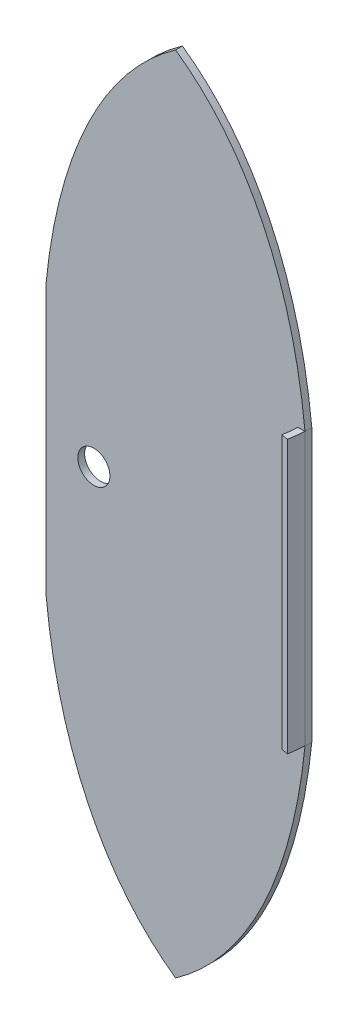
ISO-10303-21;
HEADER;
FILE_DESCRIPTION(('STEP AP214'),'2;1');
FILE_NAME('part.step','',(''),(''),'','','');
FILE_SCHEMA(('AUTOMOTIVE_DESIGN { 1 0 10303 214 1 1 1 1 }'));
ENDSEC;
DATA;
#1=APPLICATION_CONTEXT('core data for automotive mechanical design processes');
#2=APPLICATION_PROTOCOL_DEFINITION('international standard','automotive_design',2000,#1);
#3=PRODUCT_CONTEXT('',#1,'mechanical');
#4=PRODUCT('Part','Part','',(#3));
#5=PRODUCT_RELATED_PRODUCT_CATEGORY('part','',(#4));
#6=PRODUCT_DEFINITION_FORMATION('','',#4);
#7=PRODUCT_DEFINITION_CONTEXT('part definition',#1,'design');
#8=PRODUCT_DEFINITION('design','',#6,#7);
#9=PRODUCT_DEFINITION_SHAPE('','',#8);
#10=(LENGTH_UNIT() NAMED_UNIT(*) SI_UNIT(.MILLI.,.METRE.));
#11=(NAMED_UNIT(*) PLANE_ANGLE_UNIT() SI_UNIT($,.RADIAN.));
#12=(NAMED_UNIT(*) SI_UNIT($,.STERADIAN.) SOLID_ANGLE_UNIT());
#13=UNCERTAINTY_MEASURE_WITH_UNIT(LENGTH_MEASURE(1.E-05),#10,'distance_accuracy_value','');
#14=(GEOMETRIC_REPRESENTATION_CONTEXT(3) GLOBAL_UNCERTAINTY_ASSIGNED_CONTEXT((#13)) GLOBAL_UNIT_ASSIGNED_CONTEXT((#10,
#11,#12)) REPRESENTATION_CONTEXT('',''));
#15=CARTESIAN_POINT('',(0.,0.,0.));
#16=DIRECTION('',(0.,0.,1.));
#17=DIRECTION('',(1.,0.,0.));
#18=AXIS2_PLACEMENT_3D('',#15,#16,#17);
#19=CARTESIAN_POINT('',(0.,0.,2.54));
#20=DIRECTION('',(0.,0.,1.));
#21=DIRECTION('',(1.,0.,0.));
#22=AXIS2_PLACEMENT_3D('',#19,#20,#21);
#23=PLANE('',#22);
#24=CARTESIAN_POINT('',(48.26,-101.6,2.54));
#25=CARTESIAN_POINT('',(44.589659251185,-138.151390039636,2.54));
#26=CARTESIAN_POINT('',(31.4092908440623,-178.560823802817,2.54));
#27=CARTESIAN_POINT('',(0.,-200.66,2.54));
#28=B_SPLINE_CURVE_WITH_KNOTS('',3,(#24,#25,#26,#27),.UNSPECIFIED.,.F.,.F.,(4,4),(0.,1.),.UNSPECIFIED.);
#29=CARTESIAN_POINT('',(48.26,-101.6,2.54));
#30=VERTEX_POINT('',#29);
#31=CARTESIAN_POINT('',(0.,-200.66,2.54));
#32=VERTEX_POINT('',#31);
#33=EDGE_CURVE('E240',#30,#32,#28,.T.);
#34=ORIENTED_EDGE('',*,*,#33,.F.);
#35=DIRECTION('',(0.,-1.,0.));
#36=VECTOR('',#35,1.);
#37=CARTESIAN_POINT('',(48.26,0.,2.54));
#38=LINE('',#37,#36);
#39=CARTESIAN_POINT('',(48.26,0.,2.54));
#40=VERTEX_POINT('',#39);
#41=EDGE_CURVE('E136',#40,#30,#38,.T.);
#42=ORIENTED_EDGE('',*,*,#41,.F.);
#43=CARTESIAN_POINT('',(48.26,0.,2.54));
#44=CARTESIAN_POINT('',(44.5896592511849,36.5513900396363,2.54));
#45=CARTESIAN_POINT('',(31.4092908440623,76.9608238028175,2.54));
#46=CARTESIAN_POINT('',(0.,99.06,2.54));
#47=B_SPLINE_CURVE_WITH_KNOTS('',3,(#43,#44,#45,#46),.UNSPECIFIED.,.F.,.F.,(4,4),(0.,1.),.UNSPECIFIED.);
#48=CARTESIAN_POINT('',(0.,99.06,2.54));
#49=VERTEX_POINT('',#48);
#50=EDGE_CURVE('E131',#40,#49,#47,.T.);
#51=ORIENTED_EDGE('',*,*,#50,.T.);
#52=CARTESIAN_POINT('',(-48.26,0.,2.54));
#53=CARTESIAN_POINT('',(-44.5896592511849,36.5513900396363,2.54));
#54=CARTESIAN_POINT('',(-31.4092908440623,76.9608238028175,2.54));
#55=CARTESIAN_POINT('',(0.,99.06,2.54));
#56=B_SPLINE_CURVE_WITH_KNOTS('',3,(#52,#53,#54,#55),.UNSPECIFIED.,.F.,.F.,(4,4),(0.,1.),.UNSPECIFIED.);
#57=CARTESIAN_POINT('',(-48.26,0.,2.54));
#58=VERTEX_POINT('',#57);
#59=EDGE_CURVE('E113',#58,#49,#56,.T.);
#60=ORIENTED_EDGE('',*,*,#59,.F.);
#61=DIRECTION('',(0.,-1.,0.));
#62=VECTOR('',#61,1.);
#63=CARTESIAN_POINT('',(-48.26,0.,2.54));
#64=LINE('',#63,#62);
#65=CARTESIAN_POINT('',(-48.26,-101.6,2.54));
#66=VERTEX_POINT('',#65);
#67=EDGE_CURVE('E123',#58,#66,#64,.T.);
#68=ORIENTED_EDGE('',*,*,#67,.T.);
#69=CARTESIAN_POINT('',(-48.26,-101.6,2.54));
#70=CARTESIAN_POINT('',(-44.5896592511849,-138.151390039636,2.54));
#71=CARTESIAN_POINT('',(-31.4092908440623,-178.560823802818,2.54));
#72=CARTESIAN_POINT('',(0.,-200.66,2.54));
#73=B_SPLINE_CURVE_WITH_KNOTS('',3,(#69,#70,#71,#72),.UNSPECIFIED.,.F.,.F.,(4,4),(0.,1.),.UNSPECIFIED.);
#74=EDGE_CURVE('E67',#66,#32,#73,.T.);
#75=ORIENTED_EDGE('',*,*,#74,.T.);
#76=EDGE_LOOP('',(#34,#42,#51,#60,#68,#75));
#77=FACE_BOUND('',#76,.T.);
#78=CARTESIAN_POINT('',(-30.48,-50.8,2.54));
#79=DIRECTION('',(0.,0.,1.));
#80=DIRECTION('',(1.,0.,0.));
#81=AXIS2_PLACEMENT_3D('',#78,#79,#80);
#82=CIRCLE('',#81,5.9944);
#83=CARTESIAN_POINT('',(-24.4856,-50.8,2.54));
#84=VERTEX_POINT('',#83);
#85=EDGE_CURVE('E188',#84,#84,#82,.T.);
#86=ORIENTED_EDGE('',*,*,#85,.F.);
#87=EDGE_LOOP('',(#86));
#88=FACE_BOUND('',#87,.T.);
#89=DIRECTION('',(-1.,0.,0.));
#90=VECTOR('',#89,1.);
#91=CARTESIAN_POINT('',(0.,-101.6,2.54));
#92=LINE('',#91,#90);
#93=CARTESIAN_POINT('',(48.1931115409661,-101.6,2.54));
#94=VERTEX_POINT('',#93);
#95=CARTESIAN_POINT('',(45.649389919253,-101.6,2.54));
#96=VERTEX_POINT('',#95);
#97=EDGE_CURVE('E263',#94,#96,#92,.T.);
#98=ORIENTED_EDGE('',*,*,#97,.T.);
#99=DIRECTION('',(0.,1.,0.));
#100=VECTOR('',#99,1.);
#101=CARTESIAN_POINT('',(45.649389919253,0.,2.54));
#102=LINE('',#101,#100);
#103=CARTESIAN_POINT('',(45.649389919253,1.11981703314034E-13,2.54));
#104=VERTEX_POINT('',#103);
#105=EDGE_CURVE('E202',#96,#104,#102,.T.);
#106=ORIENTED_EDGE('',*,*,#105,.T.);
#107=DIRECTION('',(1.,0.,0.));
#108=VECTOR('',#107,1.);
#109=CARTESIAN_POINT('',(0.,0.,2.54));
#110=LINE('',#109,#108);
#111=CARTESIAN_POINT('',(48.1931115409661,0.,2.54));
#112=VERTEX_POINT('',#111);
#113=EDGE_CURVE('E270',#104,#112,#110,.T.);
#114=ORIENTED_EDGE('',*,*,#113,.T.);
#115=DIRECTION('',(0.,1.,0.));
#116=VECTOR('',#115,1.);
#117=CARTESIAN_POINT('',(48.1931115409661,0.,2.54));
#118=LINE('',#117,#116);
#119=EDGE_CURVE('E267',#94,#112,#118,.T.);
#120=ORIENTED_EDGE('',*,*,#119,.F.);
#121=EDGE_LOOP('',(#98,#106,#114,#120));
#122=FACE_BOUND('',#121,.T.);
#123=ADVANCED_FACE('F41',(#77,#88,#122),#23,.T.);
#124=DIRECTION('',(0.,0.,-1.));
#125=VECTOR('',#124,1.);
#126=SURFACE_OF_LINEAR_EXTRUSION('',#28,#125);
#127=CARTESIAN_POINT('',(48.26,-101.6,0.));
#128=CARTESIAN_POINT('',(44.589659251185,-138.151390039636,0.));
#129=CARTESIAN_POINT('',(31.4092908440623,-178.560823802817,0.));
#130=CARTESIAN_POINT('',(0.,-200.66,0.));
#131=B_SPLINE_CURVE_WITH_KNOTS('',3,(#127,#128,#129,#130),.UNSPECIFIED.,.F.,.F.,(4,4),(0.,1.),.UNSPECIFIED.);
#132=CARTESIAN_POINT('',(48.26,-101.6,0.));
#133=VERTEX_POINT('',#132);
#134=CARTESIAN_POINT('',(0.,-200.66,0.));
#135=VERTEX_POINT('',#134);
#136=EDGE_CURVE('E195',#133,#135,#131,.T.);
#137=ORIENTED_EDGE('',*,*,#136,.F.);
#138=DIRECTION('',(0.,0.,-1.));
#139=VECTOR('',#138,1.);
#140=CARTESIAN_POINT('',(48.26,-101.6,2.54));
#141=LINE('',#140,#139);
#142=EDGE_CURVE('E11',#30,#133,#141,.T.);
#143=ORIENTED_EDGE('',*,*,#142,.F.);
#144=ORIENTED_EDGE('',*,*,#33,.T.);
#145=DIRECTION('',(0.,0.,-1.));
#146=VECTOR('',#145,1.);
#147=CARTESIAN_POINT('',(0.,-200.66,2.54));
#148=LINE('',#147,#146);
#149=EDGE_CURVE('E93',#32,#135,#148,.T.);
#150=ORIENTED_EDGE('',*,*,#149,.T.);
#151=EDGE_LOOP('',(#137,#143,#144,#150));
#152=FACE_BOUND('',#151,.T.);
#153=ADVANCED_FACE('F43',(#152),#126,.T.);
#154=CARTESIAN_POINT('',(48.26,0.,2.54));
#155=DIRECTION('',(1.,0.,0.));
#156=DIRECTION('',(0.,1.,0.));
#157=AXIS2_PLACEMENT_3D('',#154,#155,#156);
#158=PLANE('',#157);
#159=DIRECTION('',(0.,-1.,0.));
#160=VECTOR('',#159,1.);
#161=CARTESIAN_POINT('',(48.26,0.,0.));
#162=LINE('',#161,#160);
#163=CARTESIAN_POINT('',(48.26,0.,0.));
#164=VERTEX_POINT('',#163);
#165=EDGE_CURVE('E201',#164,#133,#162,.T.);
#166=ORIENTED_EDGE('',*,*,#165,.F.);
#167=DIRECTION('',(0.,0.,-1.));
#168=VECTOR('',#167,1.);
#169=CARTESIAN_POINT('',(48.26,0.,2.54));
#170=LINE('',#169,#168);
#171=EDGE_CURVE('E51',#40,#164,#170,.T.);
#172=ORIENTED_EDGE('',*,*,#171,.F.);
#173=ORIENTED_EDGE('',*,*,#41,.T.);
#174=ORIENTED_EDGE('',*,*,#142,.T.);
#175=EDGE_LOOP('',(#166,#172,#173,#174));
#176=FACE_BOUND('',#175,.T.);
#177=ADVANCED_FACE('F156',(#176),#158,.T.);
#178=DIRECTION('',(0.,0.,-1.));
#179=VECTOR('',#178,1.);
#180=SURFACE_OF_LINEAR_EXTRUSION('',#47,#179);
#181=CARTESIAN_POINT('',(48.26,0.,0.));
#182=CARTESIAN_POINT('',(44.5896592511849,36.5513900396363,0.));
#183=CARTESIAN_POINT('',(31.4092908440623,76.9608238028175,0.));
#184=CARTESIAN_POINT('',(0.,99.06,0.));
#185=B_SPLINE_CURVE_WITH_KNOTS('',3,(#181,#182,#183,#184),.UNSPECIFIED.,.F.,.F.,(4,4),(0.,1.),.UNSPECIFIED.);
#186=CARTESIAN_POINT('',(0.,99.06,0.));
#187=VERTEX_POINT('',#186);
#188=EDGE_CURVE('E209',#164,#187,#185,.T.);
#189=ORIENTED_EDGE('',*,*,#188,.T.);
#190=DIRECTION('',(0.,0.,-1.));
#191=VECTOR('',#190,1.);
#192=CARTESIAN_POINT('',(0.,99.06,2.54));
#193=LINE('',#192,#191);
#194=EDGE_CURVE('E119',#49,#187,#193,.T.);
#195=ORIENTED_EDGE('',*,*,#194,.F.);
#196=ORIENTED_EDGE('',*,*,#50,.F.);
#197=ORIENTED_EDGE('',*,*,#171,.T.);
#198=EDGE_LOOP('',(#189,#195,#196,#197));
#199=FACE_BOUND('',#198,.T.);
#200=ADVANCED_FACE('F153',(#199),#180,.F.);
#201=DIRECTION('',(0.,0.,-1.));
#202=VECTOR('',#201,1.);
#203=SURFACE_OF_LINEAR_EXTRUSION('',#56,#202);
#204=CARTESIAN_POINT('',(-48.26,0.,0.));
#205=CARTESIAN_POINT('',(-44.5896592511849,36.5513900396363,0.));
#206=CARTESIAN_POINT('',(-31.4092908440623,76.9608238028175,0.));
#207=CARTESIAN_POINT('',(0.,99.06,0.));
#208=B_SPLINE_CURVE_WITH_KNOTS('',3,(#204,#205,#206,#207),.UNSPECIFIED.,.F.,.F.,(4,4),(0.,1.),.UNSPECIFIED.);
#209=CARTESIAN_POINT('',(-48.26,0.,0.));
#210=VERTEX_POINT('',#209);
#211=EDGE_CURVE('E115',#210,#187,#208,.T.);
#212=ORIENTED_EDGE('',*,*,#211,.F.);
#213=DIRECTION('',(0.,0.,-1.));
#214=VECTOR('',#213,1.);
#215=CARTESIAN_POINT('',(-48.26,0.,2.54));
#216=LINE('',#215,#214);
#217=EDGE_CURVE('E109',#58,#210,#216,.T.);
#218=ORIENTED_EDGE('',*,*,#217,.F.);
#219=ORIENTED_EDGE('',*,*,#59,.T.);
#220=ORIENTED_EDGE('',*,*,#194,.T.);
#221=EDGE_LOOP('',(#212,#218,#219,#220));
#222=FACE_BOUND('',#221,.T.);
#223=ADVANCED_FACE('F111',(#222),#203,.T.);
#224=CARTESIAN_POINT('',(-48.26,0.,2.54));
#225=DIRECTION('',(1.,0.,0.));
#226=DIRECTION('',(0.,1.,0.));
#227=AXIS2_PLACEMENT_3D('',#224,#225,#226);
#228=PLANE('',#227);
#229=DIRECTION('',(0.,-1.,0.));
#230=VECTOR('',#229,1.);
#231=CARTESIAN_POINT('',(-48.26,0.,0.));
#232=LINE('',#231,#230);
#233=CARTESIAN_POINT('',(-48.26,-101.6,0.));
#234=VERTEX_POINT('',#233);
#235=EDGE_CURVE('E222',#210,#234,#232,.T.);
#236=ORIENTED_EDGE('',*,*,#235,.T.);
#237=DIRECTION('',(0.,0.,-1.));
#238=VECTOR('',#237,1.);
#239=CARTESIAN_POINT('',(-48.26,-101.6,2.54));
#240=LINE('',#239,#238);
#241=EDGE_CURVE('E120',#66,#234,#240,.T.);
#242=ORIENTED_EDGE('',*,*,#241,.F.);
#243=ORIENTED_EDGE('',*,*,#67,.F.);
#244=ORIENTED_EDGE('',*,*,#217,.T.);
#245=EDGE_LOOP('',(#236,#242,#243,#244));
#246=FACE_BOUND('',#245,.T.);
#247=ADVANCED_FACE('F124',(#246),#228,.F.);
#248=DIRECTION('',(0.,0.,-1.));
#249=VECTOR('',#248,1.);
#250=SURFACE_OF_LINEAR_EXTRUSION('',#73,#249);
#251=CARTESIAN_POINT('',(-48.26,-101.6,0.));
#252=CARTESIAN_POINT('',(-44.5896592511849,-138.151390039636,0.));
#253=CARTESIAN_POINT('',(-31.4092908440623,-178.560823802818,0.));
#254=CARTESIAN_POINT('',(0.,-200.66,0.));
#255=B_SPLINE_CURVE_WITH_KNOTS('',3,(#251,#252,#253,#254),.UNSPECIFIED.,.F.,.F.,(4,4),(0.,1.),.UNSPECIFIED.);
#256=EDGE_CURVE('E228',#234,#135,#255,.T.);
#257=ORIENTED_EDGE('',*,*,#256,.T.);
#258=ORIENTED_EDGE('',*,*,#149,.F.);
#259=ORIENTED_EDGE('',*,*,#74,.F.);
#260=ORIENTED_EDGE('',*,*,#241,.T.);
#261=EDGE_LOOP('',(#257,#258,#259,#260));
#262=FACE_BOUND('',#261,.T.);
#263=ADVANCED_FACE('F179',(#262),#250,.F.);
#264=CARTESIAN_POINT('',(-30.48,-50.8,2.54));
#265=DIRECTION('',(0.,0.,-1.));
#266=DIRECTION('',(-1.,0.,0.));
#267=AXIS2_PLACEMENT_3D('',#264,#265,#266);
#268=CYLINDRICAL_SURFACE('',#267,5.9944);
#269=ORIENTED_EDGE('',*,*,#85,.T.);
#270=EDGE_LOOP('',(#269));
#271=FACE_BOUND('',#270,.T.);
#272=CARTESIAN_POINT('',(-30.48,-50.8,0.));
#273=DIRECTION('',(0.,0.,1.));
#274=DIRECTION('',(1.,0.,0.));
#275=AXIS2_PLACEMENT_3D('',#272,#273,#274);
#276=CIRCLE('',#275,5.9944);
#277=CARTESIAN_POINT('',(-24.4856,-50.8,0.));
#278=VERTEX_POINT('',#277);
#279=EDGE_CURVE('E233',#278,#278,#276,.T.);
#280=ORIENTED_EDGE('',*,*,#279,.F.);
#281=EDGE_LOOP('',(#280));
#282=FACE_BOUND('',#281,.T.);
#283=ADVANCED_FACE('F176',(#271,#282),#268,.F.);
#284=CARTESIAN_POINT('',(0.,0.,0.));
#285=DIRECTION('',(0.,0.,1.));
#286=DIRECTION('',(1.,0.,0.));
#287=AXIS2_PLACEMENT_3D('',#284,#285,#286);
#288=PLANE('',#287);
#289=ORIENTED_EDGE('',*,*,#165,.T.);
#290=ORIENTED_EDGE('',*,*,#136,.T.);
#291=ORIENTED_EDGE('',*,*,#256,.F.);
#292=ORIENTED_EDGE('',*,*,#235,.F.);
#293=ORIENTED_EDGE('',*,*,#211,.T.);
#294=ORIENTED_EDGE('',*,*,#188,.F.);
#295=EDGE_LOOP('',(#289,#290,#291,#292,#293,#294));
#296=FACE_BOUND('',#295,.T.);
#297=ORIENTED_EDGE('',*,*,#279,.T.);
#298=EDGE_LOOP('',(#297));
#299=FACE_BOUND('',#298,.T.);
#300=ADVANCED_FACE('F172',(#296,#299),#288,.F.);
#301=CARTESIAN_POINT('',(0.,0.,0.));
#302=DIRECTION('',(0.,1.,0.));
#303=DIRECTION('',(0.,0.,1.));
#304=AXIS2_PLACEMENT_3D('',#301,#302,#303);
#305=CYLINDRICAL_SURFACE('',#304,45.72);
#306=ORIENTED_EDGE('',*,*,#105,.F.);
#307=CARTESIAN_POINT('',(0.,-101.6,0.));
#308=DIRECTION('',(0.,1.,0.));
#309=DIRECTION('',(0.,0.,1.));
#310=AXIS2_PLACEMENT_3D('',#307,#308,#309);
#311=CIRCLE('',#310,45.72);
#312=CARTESIAN_POINT('',(45.0254104677181,-101.6,7.93919468293213));
#313=VERTEX_POINT('',#312);
#314=EDGE_CURVE('E274',#313,#96,#311,.T.);
#315=ORIENTED_EDGE('',*,*,#314,.F.);
#316=DIRECTION('',(0.,-1.,0.));
#317=VECTOR('',#316,1.);
#318=CARTESIAN_POINT('',(45.0254104677181,0.,7.93919468293213));
#319=LINE('',#318,#317);
#320=CARTESIAN_POINT('',(45.0254104677181,1.11981703314034E-13,7.93919468293213));
#321=VERTEX_POINT('',#320);
#322=EDGE_CURVE('E300',#321,#313,#319,.T.);
#323=ORIENTED_EDGE('',*,*,#322,.F.);
#324=CARTESIAN_POINT('',(0.,1.11981703314034E-13,0.));
#325=DIRECTION('',(0.,1.,0.));
#326=DIRECTION('',(0.,0.,1.));
#327=AXIS2_PLACEMENT_3D('',#324,#325,#326);
#328=CIRCLE('',#327,45.72);
#329=EDGE_CURVE('E284',#321,#104,#328,.T.);
#330=ORIENTED_EDGE('',*,*,#329,.T.);
#331=EDGE_LOOP('',(#306,#315,#323,#330));
#332=FACE_BOUND('',#331,.T.);
#333=ADVANCED_FACE('F175',(#332),#305,.F.);
#334=CARTESIAN_POINT('',(1.6400343633353E-12,-101.6,2.89182307545046E-13));
#335=DIRECTION('',(0.,1.,0.));
#336=DIRECTION('',(0.,0.,1.));
#337=AXIS2_PLACEMENT_3D('',#334,#335,#336);
#338=PLANE('',#337);
#339=ORIENTED_EDGE('',*,*,#97,.F.);
#340=CARTESIAN_POINT('',(0.,-101.6,0.));
#341=DIRECTION('',(0.,1.,0.));
#342=DIRECTION('',(0.,0.,1.));
#343=AXIS2_PLACEMENT_3D('',#340,#341,#342);
#344=CIRCLE('',#343,48.26);
#345=CARTESIAN_POINT('',(47.5268221603691,-101.6,8.38026105420614));
#346=VERTEX_POINT('',#345);
#347=EDGE_CURVE('E278',#346,#94,#344,.T.);
#348=ORIENTED_EDGE('',*,*,#347,.F.);
#349=DIRECTION('',(0.984807753012208,0.,0.173648177666932));
#350=VECTOR('',#349,1.);
#351=CARTESIAN_POINT('',(1.6400343633353E-12,-101.600000000001,2.89182307545046E-13));
#352=LINE('',#351,#350);
#353=EDGE_CURVE('E296',#313,#346,#352,.T.);
#354=ORIENTED_EDGE('',*,*,#353,.F.);
#355=ORIENTED_EDGE('',*,*,#314,.T.);
#356=EDGE_LOOP('',(#339,#348,#354,#355));
#357=FACE_BOUND('',#356,.T.);
#358=ADVANCED_FACE('F170',(#357),#338,.F.);
#359=CARTESIAN_POINT('',(0.,0.,0.));
#360=DIRECTION('',(0.,1.,0.));
#361=DIRECTION('',(0.,0.,1.));
#362=AXIS2_PLACEMENT_3D('',#359,#360,#361);
#363=CYLINDRICAL_SURFACE('',#362,48.26);
#364=ORIENTED_EDGE('',*,*,#347,.T.);
#365=ORIENTED_EDGE('',*,*,#119,.T.);
#366=CARTESIAN_POINT('',(0.,0.,0.));
#367=DIRECTION('',(0.,1.,0.));
#368=DIRECTION('',(0.,0.,1.));
#369=AXIS2_PLACEMENT_3D('',#366,#367,#368);
#370=CIRCLE('',#369,48.26);
#371=CARTESIAN_POINT('',(47.5268221603691,0.,8.38026105420614));
#372=VERTEX_POINT('',#371);
#373=EDGE_CURVE('E58',#372,#112,#370,.T.);
#374=ORIENTED_EDGE('',*,*,#373,.F.);
#375=DIRECTION('',(0.,-1.,0.));
#376=VECTOR('',#375,1.);
#377=CARTESIAN_POINT('',(47.5268221603691,0.,8.38026105420614));
#378=LINE('',#377,#376);
#379=EDGE_CURVE('E292',#372,#346,#378,.T.);
#380=ORIENTED_EDGE('',*,*,#379,.T.);
#381=EDGE_LOOP('',(#364,#365,#374,#380));
#382=FACE_BOUND('',#381,.T.);
#383=ADVANCED_FACE('F322',(#382),#363,.T.);
#384=CARTESIAN_POINT('',(0.,0.,0.));
#385=DIRECTION('',(0.,-1.,0.));
#386=DIRECTION('',(0.,0.,-1.));
#387=AXIS2_PLACEMENT_3D('',#384,#385,#386);
#388=PLANE('',#387);
#389=ORIENTED_EDGE('',*,*,#113,.F.);
#390=ORIENTED_EDGE('',*,*,#329,.F.);
#391=DIRECTION('',(-0.984807753012208,0.,-0.173648177666932));
#392=VECTOR('',#391,1.);
#393=CARTESIAN_POINT('',(0.,0.,0.));
#394=LINE('',#393,#392);
#395=EDGE_CURVE('E288',#372,#321,#394,.T.);
#396=ORIENTED_EDGE('',*,*,#395,.F.);
#397=ORIENTED_EDGE('',*,*,#373,.T.);
#398=EDGE_LOOP('',(#389,#390,#396,#397));
#399=FACE_BOUND('',#398,.T.);
#400=ADVANCED_FACE('F327',(#399),#388,.F.);
#401=CARTESIAN_POINT('',(0.,0.,0.));
#402=DIRECTION('',(-0.173648177666932,0.,0.984807753012208));
#403=DIRECTION('',(0.984807753012208,0.,0.173648177666932));
#404=AXIS2_PLACEMENT_3D('',#401,#402,#403);
#405=PLANE('',#404);
#406=ORIENTED_EDGE('',*,*,#322,.T.);
#407=ORIENTED_EDGE('',*,*,#353,.T.);
#408=ORIENTED_EDGE('',*,*,#379,.F.);
#409=ORIENTED_EDGE('',*,*,#395,.T.);
#410=EDGE_LOOP('',(#406,#407,#408,#409));
#411=FACE_BOUND('',#410,.T.);
#412=ADVANCED_FACE('F307',(#411),#405,.T.);
#413=CLOSED_SHELL('',(#123,#153,#177,#200,#223,#247,#263,#283,#300,#333,#358,#383,#400,#412));
#414=MANIFOLD_SOLID_BREP('B2',#413);
#415=ADVANCED_BREP_SHAPE_REPRESENTATION('',(#18,#414),#14);
#416=SHAPE_DEFINITION_REPRESENTATION(#9,#415);
ENDSEC;
END-ISO-10303-21;
